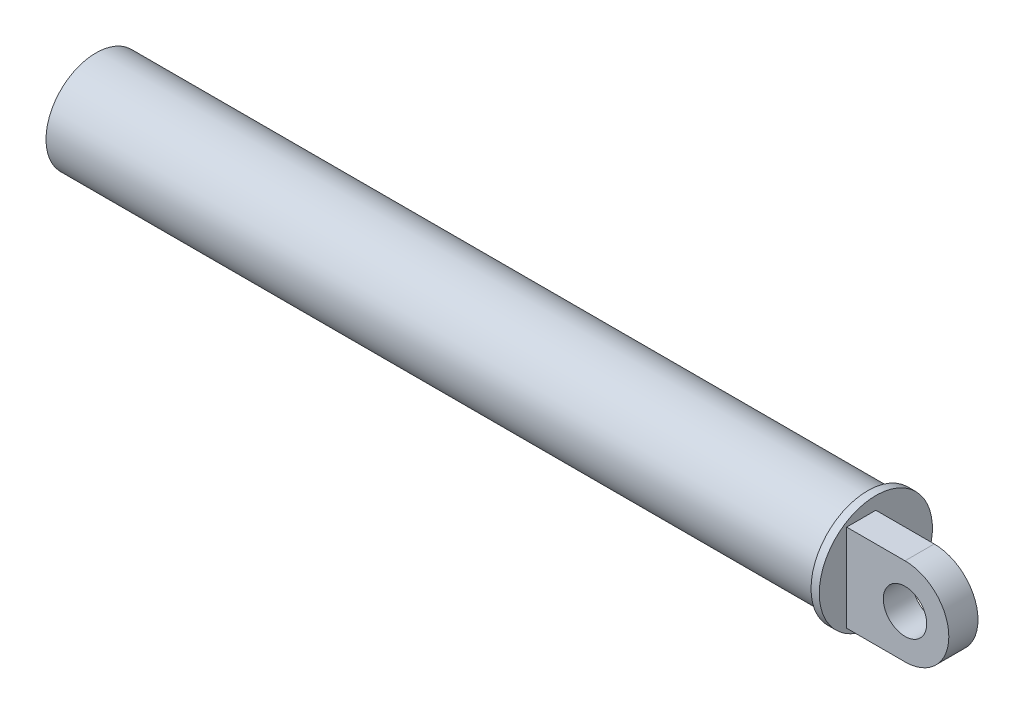
ISO-10303-21;
HEADER;
FILE_DESCRIPTION(('STEP AP214'),'2;1');
FILE_NAME('part.step','',(''),(''),'','','');
FILE_SCHEMA(('AUTOMOTIVE_DESIGN { 1 0 10303 214 1 1 1 1 }'));
ENDSEC;
DATA;
#1=APPLICATION_CONTEXT('core data for automotive mechanical design processes');
#2=APPLICATION_PROTOCOL_DEFINITION('international standard','automotive_design',2000,#1);
#3=PRODUCT_CONTEXT('',#1,'mechanical');
#4=PRODUCT('Part','Part','',(#3));
#5=PRODUCT_RELATED_PRODUCT_CATEGORY('part','',(#4));
#6=PRODUCT_DEFINITION_FORMATION('','',#4);
#7=PRODUCT_DEFINITION_CONTEXT('part definition',#1,'design');
#8=PRODUCT_DEFINITION('design','',#6,#7);
#9=PRODUCT_DEFINITION_SHAPE('','',#8);
#10=(LENGTH_UNIT() NAMED_UNIT(*) SI_UNIT(.MILLI.,.METRE.));
#11=(NAMED_UNIT(*) PLANE_ANGLE_UNIT() SI_UNIT($,.RADIAN.));
#12=(NAMED_UNIT(*) SI_UNIT($,.STERADIAN.) SOLID_ANGLE_UNIT());
#13=UNCERTAINTY_MEASURE_WITH_UNIT(LENGTH_MEASURE(1.E-05),#10,'distance_accuracy_value','');
#14=(GEOMETRIC_REPRESENTATION_CONTEXT(3) GLOBAL_UNCERTAINTY_ASSIGNED_CONTEXT((#13)) GLOBAL_UNIT_ASSIGNED_CONTEXT((#10,
#11,#12)) REPRESENTATION_CONTEXT('',''));
#15=CARTESIAN_POINT('',(0.,0.,0.));
#16=DIRECTION('',(0.,0.,1.));
#17=DIRECTION('',(1.,0.,0.));
#18=AXIS2_PLACEMENT_3D('',#15,#16,#17);
#19=CARTESIAN_POINT('',(353.853213209751,33.6129825214326,10.));
#20=DIRECTION('',(0.,0.,1.));
#21=DIRECTION('',(1.,0.,0.));
#22=AXIS2_PLACEMENT_3D('',#19,#20,#21);
#23=PLANE('',#22);
#24=DIRECTION('',(0.,-1.,0.));
#25=VECTOR('',#24,1.);
#26=CARTESIAN_POINT('',(333.853213209751,48.6129825214327,10.));
#27=LINE('',#26,#25);
#28=CARTESIAN_POINT('',(333.853213209751,48.6129825214327,10.));
#29=VERTEX_POINT('',#28);
#30=CARTESIAN_POINT('',(333.853213209751,18.6129825214327,10.));
#31=VERTEX_POINT('',#30);
#32=EDGE_CURVE('E96',#29,#31,#27,.T.);
#33=ORIENTED_EDGE('',*,*,#32,.T.);
#34=DIRECTION('',(1.,0.,0.));
#35=VECTOR('',#34,1.);
#36=CARTESIAN_POINT('',(333.853213209751,18.6129825214327,10.));
#37=LINE('',#36,#35);
#38=CARTESIAN_POINT('',(353.853213209751,18.6129825214326,10.));
#39=VERTEX_POINT('',#38);
#40=EDGE_CURVE('E75',#31,#39,#37,.T.);
#41=ORIENTED_EDGE('',*,*,#40,.T.);
#42=CARTESIAN_POINT('',(353.853213209751,33.6129825214326,10.));
#43=DIRECTION('',(0.,0.,1.));
#44=DIRECTION('',(1.,0.,0.));
#45=AXIS2_PLACEMENT_3D('',#42,#43,#44);
#46=CIRCLE('',#45,15.);
#47=CARTESIAN_POINT('',(353.853213209751,48.6129825214327,10.));
#48=VERTEX_POINT('',#47);
#49=EDGE_CURVE('E101',#39,#48,#46,.T.);
#50=ORIENTED_EDGE('',*,*,#49,.T.);
#51=DIRECTION('',(-1.,0.,0.));
#52=VECTOR('',#51,1.);
#53=CARTESIAN_POINT('',(333.853213209751,48.6129825214327,10.));
#54=LINE('',#53,#52);
#55=EDGE_CURVE('E50',#48,#29,#54,.T.);
#56=ORIENTED_EDGE('',*,*,#55,.T.);
#57=EDGE_LOOP('',(#33,#41,#50,#56));
#58=FACE_BOUND('',#57,.T.);
#59=CARTESIAN_POINT('',(353.853213209751,33.6129825214326,10.));
#60=DIRECTION('',(0.,0.,1.));
#61=DIRECTION('',(1.,0.,0.));
#62=AXIS2_PLACEMENT_3D('',#59,#60,#61);
#63=CIRCLE('',#62,7.43963392201081);
#64=CARTESIAN_POINT('',(361.292847131761,33.6129825214326,10.));
#65=VERTEX_POINT('',#64);
#66=EDGE_CURVE('E89',#65,#65,#63,.T.);
#67=ORIENTED_EDGE('',*,*,#66,.F.);
#68=EDGE_LOOP('',(#67));
#69=FACE_BOUND('',#68,.T.);
#70=ADVANCED_FACE('F33',(#58,#69),#23,.T.);
#71=CARTESIAN_POINT('',(353.853213209751,33.6129825214326,0.));
#72=DIRECTION('',(0.,0.,1.));
#73=DIRECTION('',(1.,0.,0.));
#74=AXIS2_PLACEMENT_3D('',#71,#72,#73);
#75=PLANE('',#74);
#76=DIRECTION('',(0.,-1.,0.));
#77=VECTOR('',#76,1.);
#78=CARTESIAN_POINT('',(333.853213209751,48.6129825214327,0.));
#79=LINE('',#78,#77);
#80=CARTESIAN_POINT('',(333.853213209751,48.6129825214327,0.));
#81=VERTEX_POINT('',#80);
#82=CARTESIAN_POINT('',(333.853213209751,18.6129825214327,0.));
#83=VERTEX_POINT('',#82);
#84=EDGE_CURVE('E81',#81,#83,#79,.T.);
#85=ORIENTED_EDGE('',*,*,#84,.F.);
#86=DIRECTION('',(-1.,0.,0.));
#87=VECTOR('',#86,1.);
#88=CARTESIAN_POINT('',(333.853213209751,48.6129825214327,0.));
#89=LINE('',#88,#87);
#90=CARTESIAN_POINT('',(353.853213209751,48.6129825214327,0.));
#91=VERTEX_POINT('',#90);
#92=EDGE_CURVE('E85',#91,#81,#89,.T.);
#93=ORIENTED_EDGE('',*,*,#92,.F.);
#94=CARTESIAN_POINT('',(353.853213209751,33.6129825214326,0.));
#95=DIRECTION('',(0.,0.,1.));
#96=DIRECTION('',(1.,0.,0.));
#97=AXIS2_PLACEMENT_3D('',#94,#95,#96);
#98=CIRCLE('',#97,15.);
#99=CARTESIAN_POINT('',(353.853213209751,18.6129825214326,0.));
#100=VERTEX_POINT('',#99);
#101=EDGE_CURVE('E70',#100,#91,#98,.T.);
#102=ORIENTED_EDGE('',*,*,#101,.F.);
#103=DIRECTION('',(1.,0.,0.));
#104=VECTOR('',#103,1.);
#105=CARTESIAN_POINT('',(333.853213209751,18.6129825214327,0.));
#106=LINE('',#105,#104);
#107=EDGE_CURVE('E63',#83,#100,#106,.T.);
#108=ORIENTED_EDGE('',*,*,#107,.F.);
#109=EDGE_LOOP('',(#85,#93,#102,#108));
#110=FACE_BOUND('',#109,.T.);
#111=CARTESIAN_POINT('',(353.853213209751,33.6129825214326,0.));
#112=DIRECTION('',(0.,0.,1.));
#113=DIRECTION('',(1.,0.,0.));
#114=AXIS2_PLACEMENT_3D('',#111,#112,#113);
#115=CIRCLE('',#114,7.43963392201081);
#116=CARTESIAN_POINT('',(361.292847131761,33.6129825214326,0.));
#117=VERTEX_POINT('',#116);
#118=EDGE_CURVE('E111',#117,#117,#115,.T.);
#119=ORIENTED_EDGE('',*,*,#118,.T.);
#120=EDGE_LOOP('',(#119));
#121=FACE_BOUND('',#120,.T.);
#122=ADVANCED_FACE('F83',(#110,#121),#75,.F.);
#123=CARTESIAN_POINT('',(333.853213209751,18.6129825214327,10.));
#124=DIRECTION('',(0.,1.,0.));
#125=DIRECTION('',(0.,0.,1.));
#126=AXIS2_PLACEMENT_3D('',#123,#124,#125);
#127=PLANE('',#126);
#128=ORIENTED_EDGE('',*,*,#107,.T.);
#129=DIRECTION('',(0.,0.,-1.));
#130=VECTOR('',#129,1.);
#131=CARTESIAN_POINT('',(353.853213209751,18.6129825214326,10.));
#132=LINE('',#131,#130);
#133=EDGE_CURVE('E42',#39,#100,#132,.T.);
#134=ORIENTED_EDGE('',*,*,#133,.F.);
#135=ORIENTED_EDGE('',*,*,#40,.F.);
#136=DIRECTION('',(0.,0.,-1.));
#137=VECTOR('',#136,1.);
#138=CARTESIAN_POINT('',(333.853213209751,18.6129825214327,10.));
#139=LINE('',#138,#137);
#140=EDGE_CURVE('E11',#31,#83,#139,.T.);
#141=ORIENTED_EDGE('',*,*,#140,.T.);
#142=EDGE_LOOP('',(#128,#134,#135,#141));
#143=FACE_BOUND('',#142,.T.);
#144=ADVANCED_FACE('F35',(#143),#127,.F.);
#145=CARTESIAN_POINT('',(353.853213209751,33.6129825214326,10.));
#146=DIRECTION('',(0.,0.,-1.));
#147=DIRECTION('',(-1.,0.,0.));
#148=AXIS2_PLACEMENT_3D('',#145,#146,#147);
#149=CYLINDRICAL_SURFACE('',#148,15.);
#150=ORIENTED_EDGE('',*,*,#101,.T.);
#151=DIRECTION('',(0.,0.,-1.));
#152=VECTOR('',#151,1.);
#153=CARTESIAN_POINT('',(353.853213209751,48.6129825214327,10.));
#154=LINE('',#153,#152);
#155=EDGE_CURVE('E95',#48,#91,#154,.T.);
#156=ORIENTED_EDGE('',*,*,#155,.F.);
#157=ORIENTED_EDGE('',*,*,#49,.F.);
#158=ORIENTED_EDGE('',*,*,#133,.T.);
#159=EDGE_LOOP('',(#150,#156,#157,#158));
#160=FACE_BOUND('',#159,.T.);
#161=ADVANCED_FACE('F105',(#160),#149,.T.);
#162=CARTESIAN_POINT('',(333.853213209751,48.6129825214327,10.));
#163=DIRECTION('',(0.,-1.,0.));
#164=DIRECTION('',(0.,0.,-1.));
#165=AXIS2_PLACEMENT_3D('',#162,#163,#164);
#166=PLANE('',#165);
#167=ORIENTED_EDGE('',*,*,#92,.T.);
#168=DIRECTION('',(0.,0.,-1.));
#169=VECTOR('',#168,1.);
#170=CARTESIAN_POINT('',(333.853213209751,48.6129825214327,10.));
#171=LINE('',#170,#169);
#172=EDGE_CURVE('E93',#29,#81,#171,.T.);
#173=ORIENTED_EDGE('',*,*,#172,.F.);
#174=ORIENTED_EDGE('',*,*,#55,.F.);
#175=ORIENTED_EDGE('',*,*,#155,.T.);
#176=EDGE_LOOP('',(#167,#173,#174,#175));
#177=FACE_BOUND('',#176,.T.);
#178=ADVANCED_FACE('F92',(#177),#166,.F.);
#179=CARTESIAN_POINT('',(353.853213209751,33.6129825214326,10.));
#180=DIRECTION('',(0.,0.,-1.));
#181=DIRECTION('',(-1.,0.,0.));
#182=AXIS2_PLACEMENT_3D('',#179,#180,#181);
#183=CYLINDRICAL_SURFACE('',#182,7.43963392201081);
#184=ORIENTED_EDGE('',*,*,#66,.T.);
#185=EDGE_LOOP('',(#184));
#186=FACE_BOUND('',#185,.T.);
#187=ORIENTED_EDGE('',*,*,#118,.F.);
#188=EDGE_LOOP('',(#187));
#189=FACE_BOUND('',#188,.T.);
#190=ADVANCED_FACE('F168',(#186,#189),#183,.F.);
#191=CARTESIAN_POINT('',(333.853213209751,48.6129825214327,0.));
#192=DIRECTION('',(-1.,0.,0.));
#193=DIRECTION('',(0.,0.,1.));
#194=AXIS2_PLACEMENT_3D('',#191,#192,#193);
#195=PLANE('',#194);
#196=CARTESIAN_POINT('',(333.853213209751,33.6129825214327,0.));
#197=DIRECTION('',(-1.,0.,0.));
#198=DIRECTION('',(0.,0.,1.));
#199=AXIS2_PLACEMENT_3D('',#196,#197,#198);
#200=CIRCLE('',#199,19.3806244522838);
#201=CARTESIAN_POINT('',(333.853213209751,33.6129825214327,19.3806244522838));
#202=VERTEX_POINT('',#201);
#203=EDGE_CURVE('E114',#202,#202,#200,.T.);
#204=ORIENTED_EDGE('',*,*,#203,.F.);
#205=EDGE_LOOP('',(#204));
#206=FACE_BOUND('',#205,.T.);
#207=ORIENTED_EDGE('',*,*,#172,.T.);
#208=ORIENTED_EDGE('',*,*,#84,.T.);
#209=ORIENTED_EDGE('',*,*,#140,.F.);
#210=ORIENTED_EDGE('',*,*,#32,.F.);
#211=EDGE_LOOP('',(#207,#208,#209,#210));
#212=FACE_BOUND('',#211,.T.);
#213=ADVANCED_FACE('F98',(#206,#212),#195,.F.);
#214=CARTESIAN_POINT('',(318.559263149111,33.6129825214327,0.));
#215=DIRECTION('',(-1.,0.,0.));
#216=DIRECTION('',(0.,0.,1.));
#217=AXIS2_PLACEMENT_3D('',#214,#215,#216);
#218=CYLINDRICAL_SURFACE('',#217,19.3806244522838);
#219=CARTESIAN_POINT('',(331.026376731593,33.6129825214327,0.));
#220=DIRECTION('',(-1.,0.,0.));
#221=DIRECTION('',(0.,0.,1.));
#222=AXIS2_PLACEMENT_3D('',#219,#220,#221);
#223=CIRCLE('',#222,19.3806244522838);
#224=CARTESIAN_POINT('',(331.026376731593,33.6129825214327,19.3806244522838));
#225=VERTEX_POINT('',#224);
#226=EDGE_CURVE('E119',#225,#225,#223,.T.);
#227=ORIENTED_EDGE('',*,*,#226,.F.);
#228=EDGE_LOOP('',(#227));
#229=FACE_BOUND('',#228,.T.);
#230=ORIENTED_EDGE('',*,*,#203,.T.);
#231=EDGE_LOOP('',(#230));
#232=FACE_BOUND('',#231,.T.);
#233=ADVANCED_FACE('F158',(#229,#232),#218,.T.);
#234=CARTESIAN_POINT('',(331.026376731593,52.9936069737165,0.));
#235=DIRECTION('',(1.,0.,0.));
#236=DIRECTION('',(0.,0.,-1.));
#237=AXIS2_PLACEMENT_3D('',#234,#235,#236);
#238=PLANE('',#237);
#239=CARTESIAN_POINT('',(331.026376731593,33.6129825214327,0.));
#240=DIRECTION('',(-1.,0.,0.));
#241=DIRECTION('',(0.,0.,1.));
#242=AXIS2_PLACEMENT_3D('',#239,#240,#241);
#243=CIRCLE('',#242,17.1297617284156);
#244=CARTESIAN_POINT('',(331.026376731593,33.6129825214327,17.1297617284156));
#245=VERTEX_POINT('',#244);
#246=EDGE_CURVE('E122',#245,#245,#243,.T.);
#247=ORIENTED_EDGE('',*,*,#246,.F.);
#248=EDGE_LOOP('',(#247));
#249=FACE_BOUND('',#248,.T.);
#250=ORIENTED_EDGE('',*,*,#226,.T.);
#251=EDGE_LOOP('',(#250));
#252=FACE_BOUND('',#251,.T.);
#253=ADVANCED_FACE('F152',(#249,#252),#238,.F.);
#254=CARTESIAN_POINT('',(318.559263149111,33.6129825214327,0.));
#255=DIRECTION('',(-1.,0.,0.));
#256=DIRECTION('',(0.,0.,1.));
#257=AXIS2_PLACEMENT_3D('',#254,#255,#256);
#258=CYLINDRICAL_SURFACE('',#257,17.1297617284156);
#259=CARTESIAN_POINT('',(66.6711080196523,33.6129825214327,0.));
#260=DIRECTION('',(-1.,0.,0.));
#261=DIRECTION('',(0.,0.,1.));
#262=AXIS2_PLACEMENT_3D('',#259,#260,#261);
#263=CIRCLE('',#262,17.1297617284156);
#264=CARTESIAN_POINT('',(66.6711080196523,33.6129825214327,17.1297617284156));
#265=VERTEX_POINT('',#264);
#266=EDGE_CURVE('E125',#265,#265,#263,.T.);
#267=ORIENTED_EDGE('',*,*,#266,.F.);
#268=EDGE_LOOP('',(#267));
#269=FACE_BOUND('',#268,.T.);
#270=ORIENTED_EDGE('',*,*,#246,.T.);
#271=EDGE_LOOP('',(#270));
#272=FACE_BOUND('',#271,.T.);
#273=ADVANCED_FACE('F146',(#269,#272),#258,.T.);
#274=CARTESIAN_POINT('',(66.6711080196523,50.7427442498482,0.));
#275=DIRECTION('',(1.,0.,0.));
#276=DIRECTION('',(0.,0.,-1.));
#277=AXIS2_PLACEMENT_3D('',#274,#275,#276);
#278=PLANE('',#277);
#279=CARTESIAN_POINT('',(66.6711080196523,33.6129825214327,0.));
#280=DIRECTION('',(-1.,0.,0.));
#281=DIRECTION('',(0.,0.,1.));
#282=AXIS2_PLACEMENT_3D('',#279,#280,#281);
#283=CIRCLE('',#282,8.68619090719946);
#284=CARTESIAN_POINT('',(66.6711080196523,33.6129825214327,8.68619090719946));
#285=VERTEX_POINT('',#284);
#286=EDGE_CURVE('E128',#285,#285,#283,.T.);
#287=ORIENTED_EDGE('',*,*,#286,.F.);
#288=EDGE_LOOP('',(#287));
#289=FACE_BOUND('',#288,.T.);
#290=ORIENTED_EDGE('',*,*,#266,.T.);
#291=EDGE_LOOP('',(#290));
#292=FACE_BOUND('',#291,.T.);
#293=ADVANCED_FACE('F140',(#289,#292),#278,.F.);
#294=CARTESIAN_POINT('',(318.559263149111,33.6129825214327,0.));
#295=DIRECTION('',(-1.,0.,0.));
#296=DIRECTION('',(0.,0.,1.));
#297=AXIS2_PLACEMENT_3D('',#294,#295,#296);
#298=CYLINDRICAL_SURFACE('',#297,8.68619090719946);
#299=CARTESIAN_POINT('',(318.559263149111,33.6129825214327,0.));
#300=DIRECTION('',(-1.,0.,0.));
#301=DIRECTION('',(0.,0.,1.));
#302=AXIS2_PLACEMENT_3D('',#299,#300,#301);
#303=CIRCLE('',#302,8.68619090719946);
#304=CARTESIAN_POINT('',(318.559263149111,33.6129825214327,8.68619090719946));
#305=VERTEX_POINT('',#304);
#306=EDGE_CURVE('E131',#305,#305,#303,.T.);
#307=ORIENTED_EDGE('',*,*,#306,.F.);
#308=EDGE_LOOP('',(#307));
#309=FACE_BOUND('',#308,.T.);
#310=ORIENTED_EDGE('',*,*,#286,.T.);
#311=EDGE_LOOP('',(#310));
#312=FACE_BOUND('',#311,.T.);
#313=ADVANCED_FACE('F137',(#309,#312),#298,.F.);
#314=CARTESIAN_POINT('',(318.559263149111,42.2991734286321,0.));
#315=DIRECTION('',(1.,0.,0.));
#316=DIRECTION('',(0.,0.,-1.));
#317=AXIS2_PLACEMENT_3D('',#314,#315,#316);
#318=PLANE('',#317);
#319=ORIENTED_EDGE('',*,*,#306,.T.);
#320=EDGE_LOOP('',(#319));
#321=FACE_BOUND('',#320,.T.);
#322=ADVANCED_FACE('F135',(#321),#318,.F.);
#323=CLOSED_SHELL('',(#70,#122,#144,#161,#178,#190,#213,#233,#253,#273,#293,#313,#322));
#324=MANIFOLD_SOLID_BREP('B2',#323);
#325=ADVANCED_BREP_SHAPE_REPRESENTATION('',(#18,#324),#14);
#326=SHAPE_DEFINITION_REPRESENTATION(#9,#325);
ENDSEC;
END-ISO-10303-21;
